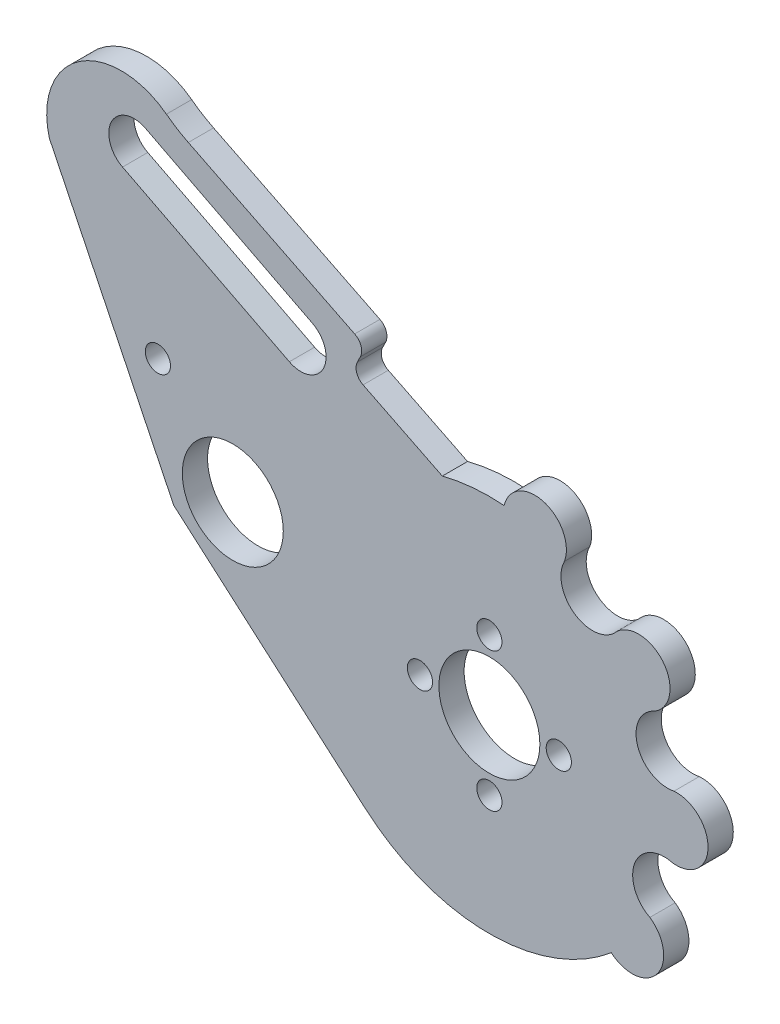
ISO-10303-21;
HEADER;
FILE_DESCRIPTION(('STEP AP214'),'2;1');
FILE_NAME('part.step','',(''),(''),'','','');
FILE_SCHEMA(('AUTOMOTIVE_DESIGN { 1 0 10303 214 1 1 1 1 }'));
ENDSEC;
DATA;
#1=APPLICATION_CONTEXT('core data for automotive mechanical design processes');
#2=APPLICATION_PROTOCOL_DEFINITION('international standard','automotive_design',2000,#1);
#3=PRODUCT_CONTEXT('',#1,'mechanical');
#4=PRODUCT('Part','Part','',(#3));
#5=PRODUCT_RELATED_PRODUCT_CATEGORY('part','',(#4));
#6=PRODUCT_DEFINITION_FORMATION('','',#4);
#7=PRODUCT_DEFINITION_CONTEXT('part definition',#1,'design');
#8=PRODUCT_DEFINITION('design','',#6,#7);
#9=PRODUCT_DEFINITION_SHAPE('','',#8);
#10=(LENGTH_UNIT() NAMED_UNIT(*) SI_UNIT(.MILLI.,.METRE.));
#11=(NAMED_UNIT(*) PLANE_ANGLE_UNIT() SI_UNIT($,.RADIAN.));
#12=(NAMED_UNIT(*) SI_UNIT($,.STERADIAN.) SOLID_ANGLE_UNIT());
#13=UNCERTAINTY_MEASURE_WITH_UNIT(LENGTH_MEASURE(1.E-05),#10,'distance_accuracy_value','');
#14=(GEOMETRIC_REPRESENTATION_CONTEXT(3) GLOBAL_UNCERTAINTY_ASSIGNED_CONTEXT((#13)) GLOBAL_UNIT_ASSIGNED_CONTEXT((#10,
#11,#12)) REPRESENTATION_CONTEXT('',''));
#15=CARTESIAN_POINT('',(0.,0.,0.));
#16=DIRECTION('',(0.,0.,1.));
#17=DIRECTION('',(1.,0.,0.));
#18=AXIS2_PLACEMENT_3D('',#15,#16,#17);
#19=CARTESIAN_POINT('',(-14.9359678839183,18.0926132591885,2.));
#20=DIRECTION('',(0.,0.,-1.));
#21=DIRECTION('',(-1.,0.,0.));
#22=AXIS2_PLACEMENT_3D('',#19,#20,#21);
#23=CYLINDRICAL_SURFACE('',#22,2.);
#24=CARTESIAN_POINT('',(-14.9359678839183,18.0926132591885,0.));
#25=DIRECTION('',(0.,0.,1.));
#26=DIRECTION('',(1.,0.,0.));
#27=AXIS2_PLACEMENT_3D('',#24,#25,#26);
#28=CIRCLE('',#27,2.);
#29=CARTESIAN_POINT('',(-15.846044198805,16.3116693799261,0.));
#30=VERTEX_POINT('',#29);
#31=CARTESIAN_POINT('',(-14.0258915690315,19.8735571384509,0.));
#32=VERTEX_POINT('',#31);
#33=EDGE_CURVE('E273',#30,#32,#28,.T.);
#34=ORIENTED_EDGE('',*,*,#33,.F.);
#35=DIRECTION('',(0.,0.,-1.));
#36=VECTOR('',#35,1.);
#37=CARTESIAN_POINT('',(-15.846044198805,16.3116693799261,2.));
#38=LINE('',#37,#36);
#39=CARTESIAN_POINT('',(-15.846044198805,16.3116693799261,2.));
#40=VERTEX_POINT('',#39);
#41=EDGE_CURVE('E224',#40,#30,#38,.T.);
#42=ORIENTED_EDGE('',*,*,#41,.F.);
#43=CARTESIAN_POINT('',(-14.9359678839183,18.0926132591885,2.));
#44=DIRECTION('',(0.,0.,1.));
#45=DIRECTION('',(1.,0.,0.));
#46=AXIS2_PLACEMENT_3D('',#43,#44,#45);
#47=CIRCLE('',#46,2.);
#48=CARTESIAN_POINT('',(-14.0258915690315,19.8735571384509,2.));
#49=VERTEX_POINT('',#48);
#50=EDGE_CURVE('E374',#40,#49,#47,.T.);
#51=ORIENTED_EDGE('',*,*,#50,.T.);
#52=DIRECTION('',(0.,0.,-1.));
#53=VECTOR('',#52,1.);
#54=CARTESIAN_POINT('',(-14.0258915690315,19.8735571384509,2.));
#55=LINE('',#54,#53);
#56=EDGE_CURVE('E213',#49,#32,#55,.T.);
#57=ORIENTED_EDGE('',*,*,#56,.T.);
#58=EDGE_LOOP('',(#34,#42,#51,#57));
#59=FACE_BOUND('',#58,.T.);
#60=ADVANCED_FACE('F35',(#59),#23,.F.);
#61=CARTESIAN_POINT('',(3.32838985168127,6.51338292974766,2.));
#62=DIRECTION('',(0.455038157443362,0.890471939631199,0.));
#63=DIRECTION('',(-0.890471939631199,0.455038157443362,0.));
#64=AXIS2_PLACEMENT_3D('',#61,#62,#63);
#65=PLANE('',#64);
#66=DIRECTION('',(0.890471939631199,-0.455038157443362,0.));
#67=VECTOR('',#66,1.);
#68=CARTESIAN_POINT('',(3.32838985168127,6.51338292974766,0.));
#69=LINE('',#68,#67);
#70=CARTESIAN_POINT('',(-29.0580755639299,23.0631212122661,0.));
#71=VERTEX_POINT('',#70);
#72=EDGE_CURVE('E276',#71,#30,#69,.T.);
#73=ORIENTED_EDGE('',*,*,#72,.F.);
#74=DIRECTION('',(0.,0.,-1.));
#75=VECTOR('',#74,1.);
#76=CARTESIAN_POINT('',(-29.0580755639299,23.0631212122661,2.));
#77=LINE('',#76,#75);
#78=CARTESIAN_POINT('',(-29.0580755639299,23.0631212122661,2.));
#79=VERTEX_POINT('',#78);
#80=EDGE_CURVE('E287',#79,#71,#77,.T.);
#81=ORIENTED_EDGE('',*,*,#80,.F.);
#82=DIRECTION('',(0.890471939631199,-0.455038157443362,0.));
#83=VECTOR('',#82,1.);
#84=CARTESIAN_POINT('',(3.32838985168127,6.51338292974766,2.));
#85=LINE('',#84,#83);
#86=EDGE_CURVE('E377',#79,#40,#85,.T.);
#87=ORIENTED_EDGE('',*,*,#86,.T.);
#88=ORIENTED_EDGE('',*,*,#41,.T.);
#89=EDGE_LOOP('',(#73,#81,#87,#88));
#90=FACE_BOUND('',#89,.T.);
#91=ADVANCED_FACE('F448',(#90),#65,.T.);
#92=CARTESIAN_POINT('',(-28.1479992490432,24.8440650915285,2.));
#93=DIRECTION('',(0.,0.,-1.));
#94=DIRECTION('',(-1.,0.,0.));
#95=AXIS2_PLACEMENT_3D('',#92,#93,#94);
#96=CYLINDRICAL_SURFACE('',#95,2.);
#97=CARTESIAN_POINT('',(-28.1479992490432,24.8440650915285,0.));
#98=DIRECTION('',(0.,0.,1.));
#99=DIRECTION('',(1.,0.,0.));
#100=AXIS2_PLACEMENT_3D('',#97,#98,#99);
#101=CIRCLE('',#100,2.);
#102=CARTESIAN_POINT('',(-27.2379229341565,26.6250089707909,0.));
#103=VERTEX_POINT('',#102);
#104=EDGE_CURVE('E279',#103,#71,#101,.T.);
#105=ORIENTED_EDGE('',*,*,#104,.F.);
#106=DIRECTION('',(0.,0.,-1.));
#107=VECTOR('',#106,1.);
#108=CARTESIAN_POINT('',(-27.2379229341565,26.6250089707909,2.));
#109=LINE('',#108,#107);
#110=CARTESIAN_POINT('',(-27.2379229341565,26.6250089707909,2.));
#111=VERTEX_POINT('',#110);
#112=EDGE_CURVE('E215',#111,#103,#109,.T.);
#113=ORIENTED_EDGE('',*,*,#112,.F.);
#114=CARTESIAN_POINT('',(-28.1479992490432,24.8440650915285,2.));
#115=DIRECTION('',(0.,0.,1.));
#116=DIRECTION('',(1.,0.,0.));
#117=AXIS2_PLACEMENT_3D('',#114,#115,#116);
#118=CIRCLE('',#117,2.);
#119=EDGE_CURVE('E380',#111,#79,#118,.T.);
#120=ORIENTED_EDGE('',*,*,#119,.T.);
#121=ORIENTED_EDGE('',*,*,#80,.T.);
#122=EDGE_LOOP('',(#105,#113,#120,#121));
#123=FACE_BOUND('',#122,.T.);
#124=ADVANCED_FACE('F454',(#123),#96,.F.);
#125=CARTESIAN_POINT('',(0.,0.,2.));
#126=DIRECTION('',(0.,0.,-1.));
#127=DIRECTION('',(-1.,0.,0.));
#128=AXIS2_PLACEMENT_3D('',#125,#126,#127);
#129=CYLINDRICAL_SURFACE('',#128,15.);
#130=CARTESIAN_POINT('',(0.,0.,0.));
#131=DIRECTION('',(0.,0.,1.));
#132=DIRECTION('',(1.,0.,0.));
#133=AXIS2_PLACEMENT_3D('',#130,#131,#132);
#134=CIRCLE('',#133,15.);
#135=CARTESIAN_POINT('',(-9.85060643306645,-11.3121860354588,0.));
#136=VERTEX_POINT('',#135);
#137=CARTESIAN_POINT('',(9.66110025477495,-11.4744560597524,0.));
#138=VERTEX_POINT('',#137);
#139=EDGE_CURVE('E212',#136,#138,#134,.T.);
#140=ORIENTED_EDGE('',*,*,#139,.T.);
#141=DIRECTION('',(0.,0.,-1.));
#142=VECTOR('',#141,1.);
#143=CARTESIAN_POINT('',(9.66110025477495,-11.4744560597524,2.));
#144=LINE('',#143,#142);
#145=CARTESIAN_POINT('',(9.66110025477495,-11.4744560597524,2.));
#146=VERTEX_POINT('',#145);
#147=EDGE_CURVE('E189',#146,#138,#144,.T.);
#148=ORIENTED_EDGE('',*,*,#147,.F.);
#149=CARTESIAN_POINT('',(0.,0.,2.));
#150=DIRECTION('',(0.,0.,1.));
#151=DIRECTION('',(1.,0.,0.));
#152=AXIS2_PLACEMENT_3D('',#149,#150,#151);
#153=CIRCLE('',#152,15.);
#154=CARTESIAN_POINT('',(-9.85060643306645,-11.3121860354588,2.));
#155=VERTEX_POINT('',#154);
#156=EDGE_CURVE('E196',#155,#146,#153,.T.);
#157=ORIENTED_EDGE('',*,*,#156,.F.);
#158=DIRECTION('',(0.,0.,-1.));
#159=VECTOR('',#158,1.);
#160=CARTESIAN_POINT('',(-9.85060643306645,-11.3121860354588,2.));
#161=LINE('',#160,#159);
#162=EDGE_CURVE('E290',#155,#136,#161,.T.);
#163=ORIENTED_EDGE('',*,*,#162,.T.);
#164=EDGE_LOOP('',(#140,#148,#157,#163));
#165=FACE_BOUND('',#164,.T.);
#166=ADVANCED_FACE('F210',(#165),#129,.T.);
#167=CARTESIAN_POINT('',(11.3067980667604,-9.59252122782368,2.));
#168=DIRECTION('',(0.,0.,-1.));
#169=DIRECTION('',(-1.,0.,0.));
#170=AXIS2_PLACEMENT_3D('',#167,#168,#169);
#171=CYLINDRICAL_SURFACE('',#170,2.5);
#172=CARTESIAN_POINT('',(11.3067980667604,-9.59252122782368,0.));
#173=DIRECTION('',(0.,0.,1.));
#174=DIRECTION('',(1.,0.,0.));
#175=AXIS2_PLACEMENT_3D('',#172,#173,#174);
#176=CIRCLE('',#175,2.5);
#177=CARTESIAN_POINT('',(12.711512496022,-7.52448414589692,0.));
#178=VERTEX_POINT('',#177);
#179=EDGE_CURVE('E329',#138,#178,#176,.T.);
#180=ORIENTED_EDGE('',*,*,#179,.T.);
#181=DIRECTION('',(0.,0.,-1.));
#182=VECTOR('',#181,1.);
#183=CARTESIAN_POINT('',(12.711512496022,-7.52448414589692,2.));
#184=LINE('',#183,#182);
#185=CARTESIAN_POINT('',(12.711512496022,-7.52448414589692,2.));
#186=VERTEX_POINT('',#185);
#187=EDGE_CURVE('E191',#186,#178,#184,.T.);
#188=ORIENTED_EDGE('',*,*,#187,.F.);
#189=CARTESIAN_POINT('',(11.3067980667604,-9.59252122782368,2.));
#190=DIRECTION('',(0.,0.,1.));
#191=DIRECTION('',(1.,0.,0.));
#192=AXIS2_PLACEMENT_3D('',#189,#190,#191);
#193=CIRCLE('',#192,2.5);
#194=EDGE_CURVE('E184',#146,#186,#193,.T.);
#195=ORIENTED_EDGE('',*,*,#194,.F.);
#196=ORIENTED_EDGE('',*,*,#147,.T.);
#197=EDGE_LOOP('',(#180,#188,#195,#196));
#198=FACE_BOUND('',#197,.T.);
#199=ADVANCED_FACE('F187',(#198),#171,.T.);
#200=CARTESIAN_POINT('',(13.8488157974996,-5.29815505960978,2.));
#201=DIRECTION('',(0.,0.,-1.));
#202=DIRECTION('',(-1.,0.,0.));
#203=AXIS2_PLACEMENT_3D('',#200,#201,#202);
#204=CYLINDRICAL_SURFACE('',#203,2.5);
#205=CARTESIAN_POINT('',(13.8488157974996,-5.29815505960978,0.));
#206=DIRECTION('',(0.,0.,1.));
#207=DIRECTION('',(1.,0.,0.));
#208=AXIS2_PLACEMENT_3D('',#205,#206,#207);
#209=CIRCLE('',#208,2.5);
#210=CARTESIAN_POINT('',(14.4878912158803,-2.88121844281123,0.));
#211=VERTEX_POINT('',#210);
#212=EDGE_CURVE('E323',#211,#178,#209,.T.);
#213=ORIENTED_EDGE('',*,*,#212,.F.);
#214=DIRECTION('',(0.,0.,-1.));
#215=VECTOR('',#214,1.);
#216=CARTESIAN_POINT('',(14.4878912158803,-2.88121844281123,2.));
#217=LINE('',#216,#215);
#218=CARTESIAN_POINT('',(14.4878912158803,-2.88121844281123,2.));
#219=VERTEX_POINT('',#218);
#220=EDGE_CURVE('E217',#219,#211,#217,.T.);
#221=ORIENTED_EDGE('',*,*,#220,.F.);
#222=CARTESIAN_POINT('',(13.8488157974996,-5.29815505960978,2.));
#223=DIRECTION('',(0.,0.,1.));
#224=DIRECTION('',(1.,0.,0.));
#225=AXIS2_PLACEMENT_3D('',#222,#223,#224);
#226=CIRCLE('',#225,2.5);
#227=EDGE_CURVE('E195',#219,#186,#226,.T.);
#228=ORIENTED_EDGE('',*,*,#227,.T.);
#229=ORIENTED_EDGE('',*,*,#187,.T.);
#230=EDGE_LOOP('',(#213,#221,#228,#229));
#231=FACE_BOUND('',#230,.T.);
#232=ADVANCED_FACE('F328',(#231),#204,.F.);
#233=CARTESIAN_POINT('',(14.8221859615863,-0.403669851361737,2.));
#234=DIRECTION('',(0.,0.,-1.));
#235=DIRECTION('',(-1.,0.,0.));
#236=AXIS2_PLACEMENT_3D('',#233,#234,#235);
#237=CYLINDRICAL_SURFACE('',#236,2.5);
#238=CARTESIAN_POINT('',(14.8221859615863,-0.403669851361737,0.));
#239=DIRECTION('',(0.,0.,1.));
#240=DIRECTION('',(1.,0.,0.));
#241=AXIS2_PLACEMENT_3D('',#238,#239,#240);
#242=CIRCLE('',#241,2.5);
#243=CARTESIAN_POINT('',(14.6232346563307,2.08840125078144,0.));
#244=VERTEX_POINT('',#243);
#245=EDGE_CURVE('E317',#211,#244,#242,.T.);
#246=ORIENTED_EDGE('',*,*,#245,.T.);
#247=DIRECTION('',(0.,0.,-1.));
#248=VECTOR('',#247,1.);
#249=CARTESIAN_POINT('',(14.6232346563307,2.08840125078144,2.));
#250=LINE('',#249,#248);
#251=CARTESIAN_POINT('',(14.6232346563307,2.08840125078144,2.));
#252=VERTEX_POINT('',#251);
#253=EDGE_CURVE('E310',#252,#244,#250,.T.);
#254=ORIENTED_EDGE('',*,*,#253,.F.);
#255=CARTESIAN_POINT('',(14.8221859615863,-0.403669851361737,2.));
#256=DIRECTION('',(0.,0.,1.));
#257=DIRECTION('',(1.,0.,0.));
#258=AXIS2_PLACEMENT_3D('',#255,#256,#257);
#259=CIRCLE('',#258,2.5);
#260=EDGE_CURVE('E319',#219,#252,#259,.T.);
#261=ORIENTED_EDGE('',*,*,#260,.F.);
#262=ORIENTED_EDGE('',*,*,#220,.T.);
#263=EDGE_LOOP('',(#246,#254,#261,#262));
#264=FACE_BOUND('',#263,.T.);
#265=ADVANCED_FACE('F315',(#264),#237,.T.);
#266=CARTESIAN_POINT('',(14.1166554686715,4.53653881363009,2.));
#267=DIRECTION('',(0.,0.,-1.));
#268=DIRECTION('',(-1.,0.,0.));
#269=AXIS2_PLACEMENT_3D('',#266,#267,#268);
#270=CYLINDRICAL_SURFACE('',#269,2.50000000000001);
#271=CARTESIAN_POINT('',(14.1166554686715,4.53653881363009,0.));
#272=DIRECTION('',(0.,0.,1.));
#273=DIRECTION('',(1.,0.,0.));
#274=AXIS2_PLACEMENT_3D('',#271,#272,#273);
#275=CIRCLE('',#274,2.50000000000001);
#276=CARTESIAN_POINT('',(13.1022125420899,6.82146891074653,0.));
#277=VERTEX_POINT('',#276);
#278=EDGE_CURVE('E326',#277,#244,#275,.T.);
#279=ORIENTED_EDGE('',*,*,#278,.F.);
#280=DIRECTION('',(0.,0.,-1.));
#281=VECTOR('',#280,1.);
#282=CARTESIAN_POINT('',(13.1022125420899,6.82146891074653,2.));
#283=LINE('',#282,#281);
#284=CARTESIAN_POINT('',(13.1022125420899,6.82146891074653,2.));
#285=VERTEX_POINT('',#284);
#286=EDGE_CURVE('E308',#285,#277,#283,.T.);
#287=ORIENTED_EDGE('',*,*,#286,.F.);
#288=CARTESIAN_POINT('',(14.1166554686715,4.53653881363009,2.));
#289=DIRECTION('',(0.,0.,1.));
#290=DIRECTION('',(1.,0.,0.));
#291=AXIS2_PLACEMENT_3D('',#288,#289,#290);
#292=CIRCLE('',#291,2.50000000000001);
#293=EDGE_CURVE('E424',#285,#252,#292,.T.);
#294=ORIENTED_EDGE('',*,*,#293,.T.);
#295=ORIENTED_EDGE('',*,*,#253,.T.);
#296=EDGE_LOOP('',(#279,#287,#294,#295));
#297=FACE_BOUND('',#296,.T.);
#298=ADVANCED_FACE('F438',(#297),#270,.F.);
#299=CARTESIAN_POINT('',(11.8121393603798,8.96289628187838,2.));
#300=DIRECTION('',(0.,0.,-1.));
#301=DIRECTION('',(-1.,0.,0.));
#302=AXIS2_PLACEMENT_3D('',#299,#300,#301);
#303=CYLINDRICAL_SURFACE('',#302,2.5);
#304=CARTESIAN_POINT('',(11.8121393603798,8.96289628187838,0.));
#305=DIRECTION('',(0.,0.,1.));
#306=DIRECTION('',(1.,0.,0.));
#307=AXIS2_PLACEMENT_3D('',#304,#305,#306);
#308=CIRCLE('',#307,2.5);
#309=CARTESIAN_POINT('',(10.0971101914994,10.7818726285881,0.));
#310=VERTEX_POINT('',#309);
#311=EDGE_CURVE('E335',#277,#310,#308,.T.);
#312=ORIENTED_EDGE('',*,*,#311,.T.);
#313=DIRECTION('',(0.,0.,-1.));
#314=VECTOR('',#313,1.);
#315=CARTESIAN_POINT('',(10.0971101914994,10.7818726285881,2.));
#316=LINE('',#315,#314);
#317=CARTESIAN_POINT('',(10.0971101914994,10.7818726285881,2.));
#318=VERTEX_POINT('',#317);
#319=EDGE_CURVE('E306',#318,#310,#316,.T.);
#320=ORIENTED_EDGE('',*,*,#319,.F.);
#321=CARTESIAN_POINT('',(11.8121393603798,8.96289628187838,2.));
#322=DIRECTION('',(0.,0.,1.));
#323=DIRECTION('',(1.,0.,0.));
#324=AXIS2_PLACEMENT_3D('',#321,#322,#323);
#325=CIRCLE('',#324,2.5);
#326=EDGE_CURVE('E427',#285,#318,#325,.T.);
#327=ORIENTED_EDGE('',*,*,#326,.F.);
#328=ORIENTED_EDGE('',*,*,#286,.T.);
#329=EDGE_LOOP('',(#312,#320,#327,#328));
#330=FACE_BOUND('',#329,.T.);
#331=ADVANCED_FACE('F436',(#330),#303,.T.);
#332=CARTESIAN_POINT('',(8.16966887854774,12.3740315355842,2.));
#333=DIRECTION('',(0.,0.,-1.));
#334=DIRECTION('',(-1.,0.,0.));
#335=AXIS2_PLACEMENT_3D('',#332,#333,#334);
#336=CYLINDRICAL_SURFACE('',#335,2.5);
#337=CARTESIAN_POINT('',(8.16966887854774,12.3740315355842,0.));
#338=DIRECTION('',(0.,0.,1.));
#339=DIRECTION('',(1.,0.,0.));
#340=AXIS2_PLACEMENT_3D('',#337,#338,#339);
#341=CIRCLE('',#340,2.5);
#342=CARTESIAN_POINT('',(5.94831385553742,13.5210197054215,0.));
#343=VERTEX_POINT('',#342);
#344=EDGE_CURVE('E338',#343,#310,#341,.T.);
#345=ORIENTED_EDGE('',*,*,#344,.F.);
#346=DIRECTION('',(0.,0.,-1.));
#347=VECTOR('',#346,1.);
#348=CARTESIAN_POINT('',(5.94831385553742,13.5210197054215,2.));
#349=LINE('',#348,#347);
#350=CARTESIAN_POINT('',(5.94831385553742,13.5210197054215,2.));
#351=VERTEX_POINT('',#350);
#352=EDGE_CURVE('E304',#351,#343,#349,.T.);
#353=ORIENTED_EDGE('',*,*,#352,.F.);
#354=CARTESIAN_POINT('',(8.16966887854774,12.3740315355842,2.));
#355=DIRECTION('',(0.,0.,1.));
#356=DIRECTION('',(1.,0.,0.));
#357=AXIS2_PLACEMENT_3D('',#354,#355,#356);
#358=CIRCLE('',#357,2.5);
#359=EDGE_CURVE('E417',#351,#318,#358,.T.);
#360=ORIENTED_EDGE('',*,*,#359,.T.);
#361=ORIENTED_EDGE('',*,*,#319,.T.);
#362=EDGE_LOOP('',(#345,#353,#360,#361));
#363=FACE_BOUND('',#362,.T.);
#364=ADVANCED_FACE('F431',(#363),#336,.F.);
#365=CARTESIAN_POINT('',(3.60182460345563,14.3835672054844,2.));
#366=DIRECTION('',(0.,0.,-1.));
#367=DIRECTION('',(-1.,0.,0.));
#368=AXIS2_PLACEMENT_3D('',#365,#366,#367);
#369=CYLINDRICAL_SURFACE('',#368,2.5);
#370=CARTESIAN_POINT('',(3.60182460345563,14.3835672054844,0.));
#371=DIRECTION('',(0.,0.,1.));
#372=DIRECTION('',(1.,0.,0.));
#373=AXIS2_PLACEMENT_3D('',#370,#371,#372);
#374=CIRCLE('',#373,2.5);
#375=CARTESIAN_POINT('',(1.16788239643984,14.95446591183,0.));
#376=VERTEX_POINT('',#375);
#377=EDGE_CURVE('E341',#343,#376,#374,.T.);
#378=ORIENTED_EDGE('',*,*,#377,.T.);
#379=DIRECTION('',(0.,0.,-1.));
#380=VECTOR('',#379,1.);
#381=CARTESIAN_POINT('',(1.16788239643984,14.95446591183,2.));
#382=LINE('',#381,#380);
#383=CARTESIAN_POINT('',(1.16788239643984,14.95446591183,2.));
#384=VERTEX_POINT('',#383);
#385=EDGE_CURVE('E301',#384,#376,#382,.T.);
#386=ORIENTED_EDGE('',*,*,#385,.F.);
#387=CARTESIAN_POINT('',(3.60182460345563,14.3835672054844,2.));
#388=DIRECTION('',(0.,0.,1.));
#389=DIRECTION('',(1.,0.,0.));
#390=AXIS2_PLACEMENT_3D('',#387,#388,#389);
#391=CIRCLE('',#390,2.5);
#392=EDGE_CURVE('E416',#351,#384,#391,.T.);
#393=ORIENTED_EDGE('',*,*,#392,.F.);
#394=ORIENTED_EDGE('',*,*,#352,.T.);
#395=EDGE_LOOP('',(#378,#386,#393,#394));
#396=FACE_BOUND('',#395,.T.);
#397=ADVANCED_FACE('F487',(#396),#369,.T.);
#398=CARTESIAN_POINT('',(-3.72843212824844,14.529239273446,0.));
#399=VERTEX_POINT('',#398);
#400=EDGE_CURVE('E343',#376,#399,#134,.T.);
#401=ORIENTED_EDGE('',*,*,#400,.T.);
#402=DIRECTION('',(0.,0.,-1.));
#403=VECTOR('',#402,1.);
#404=CARTESIAN_POINT('',(-3.72843212824844,14.529239273446,2.));
#405=LINE('',#404,#403);
#406=CARTESIAN_POINT('',(-3.72843212824844,14.529239273446,2.));
#407=VERTEX_POINT('',#406);
#408=EDGE_CURVE('E298',#407,#399,#405,.T.);
#409=ORIENTED_EDGE('',*,*,#408,.F.);
#410=EDGE_CURVE('E209',#384,#407,#153,.T.);
#411=ORIENTED_EDGE('',*,*,#410,.F.);
#412=ORIENTED_EDGE('',*,*,#385,.T.);
#413=EDGE_LOOP('',(#401,#409,#411,#412));
#414=FACE_BOUND('',#413,.T.);
#415=ADVANCED_FACE('F402',(#414),#129,.T.);
#416=CARTESIAN_POINT('',(5.0508803223758,10.1683141739315,2.));
#417=DIRECTION('',(0.444867319818385,0.895596487128889,0.));
#418=DIRECTION('',(-0.895596487128889,0.444867319818385,0.));
#419=AXIS2_PLACEMENT_3D('',#416,#417,#418);
#420=PLANE('',#419);
#421=DIRECTION('',(0.895596487128889,-0.444867319818385,0.));
#422=VECTOR('',#421,1.);
#423=CARTESIAN_POINT('',(5.0508803223758,10.1683141739315,0.));
#424=LINE('',#423,#422);
#425=CARTESIAN_POINT('',(-10.006536836479,17.6477459393702,0.));
#426=VERTEX_POINT('',#425);
#427=EDGE_CURVE('E344',#426,#399,#424,.T.);
#428=ORIENTED_EDGE('',*,*,#427,.F.);
#429=DIRECTION('',(0.,0.,-1.));
#430=VECTOR('',#429,1.);
#431=CARTESIAN_POINT('',(-10.006536836479,17.6477459393702,2.));
#432=LINE('',#431,#430);
#433=CARTESIAN_POINT('',(-10.006536836479,17.6477459393702,2.));
#434=VERTEX_POINT('',#433);
#435=EDGE_CURVE('E227',#426,#434,#432,.F.);
#436=ORIENTED_EDGE('',*,*,#435,.T.);
#437=DIRECTION('',(0.895596487128889,-0.444867319818385,0.));
#438=VECTOR('',#437,1.);
#439=CARTESIAN_POINT('',(5.0508803223758,10.1683141739315,2.));
#440=LINE('',#439,#438);
#441=EDGE_CURVE('E362',#434,#407,#440,.T.);
#442=ORIENTED_EDGE('',*,*,#441,.T.);
#443=ORIENTED_EDGE('',*,*,#408,.T.);
#444=EDGE_LOOP('',(#428,#436,#442,#443));
#445=FACE_BOUND('',#444,.T.);
#446=ADVANCED_FACE('F410',(#445),#420,.T.);
#447=CARTESIAN_POINT('',(-15.9530136459837,7.92429908525706,2.));
#448=DIRECTION('',(-0.895596487128889,0.444867319818385,0.));
#449=DIRECTION('',(-0.444867319818385,-0.895596487128889,0.));
#450=AXIS2_PLACEMENT_3D('',#447,#448,#449);
#451=PLANE('',#450);
#452=DIRECTION('',(0.444867319818385,0.895596487128889,0.));
#453=VECTOR('',#452,1.);
#454=CARTESIAN_POINT('',(-15.9530136459837,7.92429908525706,2.));
#455=LINE('',#454,#453);
#456=CARTESIAN_POINT('',(-10.4572660037895,18.9882097463174,2.));
#457=VERTEX_POINT('',#456);
#458=CARTESIAN_POINT('',(-10.2190110297542,19.4678590895735,2.));
#459=VERTEX_POINT('',#458);
#460=EDGE_CURVE('E357',#457,#459,#455,.T.);
#461=ORIENTED_EDGE('',*,*,#460,.F.);
#462=DIRECTION('',(0.,0.,-1.));
#463=VECTOR('',#462,1.);
#464=CARTESIAN_POINT('',(-10.4572660037895,18.9882097463174,2.));
#465=LINE('',#464,#463);
#466=CARTESIAN_POINT('',(-10.4572660037895,18.9882097463174,0.));
#467=VERTEX_POINT('',#466);
#468=EDGE_CURVE('E223',#457,#467,#465,.T.);
#469=ORIENTED_EDGE('',*,*,#468,.T.);
#470=DIRECTION('',(0.444867319818385,0.895596487128889,0.));
#471=VECTOR('',#470,1.);
#472=CARTESIAN_POINT('',(-15.9530136459837,7.92429908525706,0.));
#473=LINE('',#472,#471);
#474=CARTESIAN_POINT('',(-10.2190110297542,19.4678590895735,0.));
#475=VERTEX_POINT('',#474);
#476=EDGE_CURVE('E262',#467,#475,#473,.T.);
#477=ORIENTED_EDGE('',*,*,#476,.T.);
#478=DIRECTION('',(0.,0.,-1.));
#479=VECTOR('',#478,1.);
#480=CARTESIAN_POINT('',(-10.2190110297543,19.4678590895735,2.));
#481=LINE('',#480,#479);
#482=EDGE_CURVE('E221',#475,#459,#481,.F.);
#483=ORIENTED_EDGE('',*,*,#482,.T.);
#484=EDGE_LOOP('',(#461,#469,#477,#483));
#485=FACE_BOUND('',#484,.T.);
#486=ADVANCED_FACE('F350',(#485),#451,.F.);
#487=CARTESIAN_POINT('',(6.17886993604783,12.4391564914453,2.));
#488=DIRECTION('',(-0.444867319818385,-0.895596487128889,0.));
#489=DIRECTION('',(0.895596487128889,-0.444867319818385,0.));
#490=AXIS2_PLACEMENT_3D('',#487,#488,#489);
#491=PLANE('',#490);
#492=DIRECTION('',(-0.895596487128889,0.444867319818385,0.));
#493=VECTOR('',#492,1.);
#494=CARTESIAN_POINT('',(6.17886993604783,12.4391564914453,0.));
#495=LINE('',#494,#493);
#496=CARTESIAN_POINT('',(-10.6697401970648,20.8083228965207,0.));
#497=VERTEX_POINT('',#496);
#498=CARTESIAN_POINT('',(-23.8481710126918,27.3544106498957,0.));
#499=VERTEX_POINT('',#498);
#500=EDGE_CURVE('E258',#497,#499,#495,.T.);
#501=ORIENTED_EDGE('',*,*,#500,.T.);
#502=DIRECTION('',(0.,0.,1.));
#503=VECTOR('',#502,1.);
#504=CARTESIAN_POINT('',(-23.8481710126918,27.3544106498957,2.));
#505=LINE('',#504,#503);
#506=CARTESIAN_POINT('',(-23.8481710126918,27.3544106498957,2.));
#507=VERTEX_POINT('',#506);
#508=EDGE_CURVE('E56',#499,#507,#505,.T.);
#509=ORIENTED_EDGE('',*,*,#508,.T.);
#510=DIRECTION('',(-0.895596487128889,0.444867319818385,0.));
#511=VECTOR('',#510,1.);
#512=CARTESIAN_POINT('',(6.17886993604783,12.4391564914453,2.));
#513=LINE('',#512,#511);
#514=CARTESIAN_POINT('',(-10.6697401970648,20.8083228965207,2.));
#515=VERTEX_POINT('',#514);
#516=EDGE_CURVE('E356',#515,#507,#513,.T.);
#517=ORIENTED_EDGE('',*,*,#516,.F.);
#518=DIRECTION('',(0.,0.,-1.));
#519=VECTOR('',#518,1.);
#520=CARTESIAN_POINT('',(-10.6697401970648,20.8083228965207,2.));
#521=LINE('',#520,#519);
#522=EDGE_CURVE('E229',#515,#497,#521,.T.);
#523=ORIENTED_EDGE('',*,*,#522,.T.);
#524=EDGE_LOOP('',(#501,#509,#517,#523));
#525=FACE_BOUND('',#524,.T.);
#526=ADVANCED_FACE('F358',(#525),#491,.F.);
#527=CARTESIAN_POINT('',(-29.1494212263783,23.7070956599862,2.));
#528=DIRECTION('',(0.,0.,-1.));
#529=DIRECTION('',(-1.,0.,0.));
#530=AXIS2_PLACEMENT_3D('',#527,#528,#529);
#531=CYLINDRICAL_SURFACE('',#530,5.91606989611819);
#532=CARTESIAN_POINT('',(-29.1494212263783,23.7070956599862,2.));
#533=DIRECTION('',(0.,0.,1.));
#534=DIRECTION('',(1.,0.,0.));
#535=AXIS2_PLACEMENT_3D('',#532,#533,#534);
#536=CIRCLE('',#535,5.91606989611819);
#537=CARTESIAN_POINT('',(-25.583989366889,28.4280678767117,2.));
#538=VERTEX_POINT('',#537);
#539=CARTESIAN_POINT('',(-34.8560748827532,22.1469716066049,2.));
#540=VERTEX_POINT('',#539);
#541=EDGE_CURVE('E250',#538,#540,#536,.T.);
#542=ORIENTED_EDGE('',*,*,#541,.F.);
#543=DIRECTION('',(0.,0.,-1.));
#544=VECTOR('',#543,1.);
#545=CARTESIAN_POINT('',(-25.583989366889,28.4280678767117,2.));
#546=LINE('',#545,#544);
#547=CARTESIAN_POINT('',(-25.583989366889,28.4280678767117,0.));
#548=VERTEX_POINT('',#547);
#549=EDGE_CURVE('E240',#538,#548,#546,.T.);
#550=ORIENTED_EDGE('',*,*,#549,.T.);
#551=CARTESIAN_POINT('',(-29.1494212263783,23.7070956599862,0.));
#552=DIRECTION('',(0.,0.,1.));
#553=DIRECTION('',(1.,0.,0.));
#554=AXIS2_PLACEMENT_3D('',#551,#552,#553);
#555=CIRCLE('',#554,5.91606989611819);
#556=CARTESIAN_POINT('',(-34.8560748827532,22.1469716066049,0.));
#557=VERTEX_POINT('',#556);
#558=EDGE_CURVE('E248',#548,#557,#555,.T.);
#559=ORIENTED_EDGE('',*,*,#558,.T.);
#560=DIRECTION('',(0.,0.,-1.));
#561=VECTOR('',#560,1.);
#562=CARTESIAN_POINT('',(-34.8560748827532,22.1469716066049,2.));
#563=LINE('',#562,#561);
#564=EDGE_CURVE('E296',#540,#557,#563,.T.);
#565=ORIENTED_EDGE('',*,*,#564,.F.);
#566=EDGE_LOOP('',(#542,#550,#559,#565));
#567=FACE_BOUND('',#566,.T.);
#568=ADVANCED_FACE('F246',(#567),#531,.T.);
#569=CARTESIAN_POINT('',(-19.4840843288905,-9.47234706105984,2.));
#570=DIRECTION('',(0.899351207341315,0.437226950054224,0.));
#571=DIRECTION('',(-0.437226950054224,0.899351207341315,0.));
#572=AXIS2_PLACEMENT_3D('',#569,#570,#571);
#573=PLANE('',#572);
#574=DIRECTION('',(0.437226950054225,-0.899351207341315,0.));
#575=VECTOR('',#574,1.);
#576=CARTESIAN_POINT('',(-19.4840843288905,-9.47234706105984,0.));
#577=LINE('',#576,#575);
#578=CARTESIAN_POINT('',(-25.0052814935504,1.88444449854211,0.));
#579=VERTEX_POINT('',#578);
#580=EDGE_CURVE('E257',#557,#579,#577,.T.);
#581=ORIENTED_EDGE('',*,*,#580,.T.);
#582=DIRECTION('',(0.,0.,-1.));
#583=VECTOR('',#582,1.);
#584=CARTESIAN_POINT('',(-25.0052814935504,1.88444449854211,2.));
#585=LINE('',#584,#583);
#586=CARTESIAN_POINT('',(-25.0052814935504,1.88444449854211,2.));
#587=VERTEX_POINT('',#586);
#588=EDGE_CURVE('E292',#587,#579,#585,.T.);
#589=ORIENTED_EDGE('',*,*,#588,.F.);
#590=DIRECTION('',(0.437226950054225,-0.899351207341315,0.));
#591=VECTOR('',#590,1.);
#592=CARTESIAN_POINT('',(-19.4840843288905,-9.47234706105984,2.));
#593=LINE('',#592,#591);
#594=EDGE_CURVE('E360',#540,#587,#593,.T.);
#595=ORIENTED_EDGE('',*,*,#594,.F.);
#596=ORIENTED_EDGE('',*,*,#564,.T.);
#597=EDGE_LOOP('',(#581,#589,#595,#596));
#598=FACE_BOUND('',#597,.T.);
#599=ADVANCED_FACE('F464',(#598),#573,.F.);
#600=CARTESIAN_POINT('',(-20.325227828694,4.43909071557608,2.));
#601=DIRECTION('',(0.,0.,-1.));
#602=DIRECTION('',(-1.,0.,0.));
#603=AXIS2_PLACEMENT_3D('',#600,#601,#602);
#604=CYLINDRICAL_SURFACE('',#603,4.);
#605=CARTESIAN_POINT('',(-20.325227828694,4.43909071557608,2.));
#606=DIRECTION('',(0.,0.,1.));
#607=DIRECTION('',(1.,0.,0.));
#608=AXIS2_PLACEMENT_3D('',#605,#606,#607);
#609=CIRCLE('',#608,4.);
#610=CARTESIAN_POINT('',(-16.325227828694,4.43909071557608,2.));
#611=VERTEX_POINT('',#610);
#612=EDGE_CURVE('E371',#611,#611,#609,.T.);
#613=ORIENTED_EDGE('',*,*,#612,.T.);
#614=EDGE_LOOP('',(#613));
#615=FACE_BOUND('',#614,.T.);
#616=CARTESIAN_POINT('',(-20.325227828694,4.43909071557608,0.));
#617=DIRECTION('',(0.,0.,1.));
#618=DIRECTION('',(1.,0.,0.));
#619=AXIS2_PLACEMENT_3D('',#616,#617,#618);
#620=CIRCLE('',#619,4.);
#621=CARTESIAN_POINT('',(-16.325227828694,4.43909071557608,0.));
#622=VERTEX_POINT('',#621);
#623=EDGE_CURVE('E270',#622,#622,#620,.T.);
#624=ORIENTED_EDGE('',*,*,#623,.F.);
#625=EDGE_LOOP('',(#624));
#626=FACE_BOUND('',#625,.T.);
#627=ADVANCED_FACE('F460',(#615,#626),#604,.F.);
#628=CARTESIAN_POINT('',(-26.2563871432768,11.3193235152207,2.));
#629=DIRECTION('',(0.,0.,-1.));
#630=DIRECTION('',(-1.,0.,0.));
#631=AXIS2_PLACEMENT_3D('',#628,#629,#630);
#632=CYLINDRICAL_SURFACE('',#631,1.);
#633=CARTESIAN_POINT('',(-26.2563871432768,11.3193235152207,2.));
#634=DIRECTION('',(0.,0.,1.));
#635=DIRECTION('',(1.,0.,0.));
#636=AXIS2_PLACEMENT_3D('',#633,#634,#635);
#637=CIRCLE('',#636,1.);
#638=CARTESIAN_POINT('',(-25.2563871432768,11.3193235152207,2.));
#639=VERTEX_POINT('',#638);
#640=EDGE_CURVE('E368',#639,#639,#637,.T.);
#641=ORIENTED_EDGE('',*,*,#640,.T.);
#642=EDGE_LOOP('',(#641));
#643=FACE_BOUND('',#642,.T.);
#644=CARTESIAN_POINT('',(-26.2563871432768,11.3193235152207,0.));
#645=DIRECTION('',(0.,0.,1.));
#646=DIRECTION('',(1.,0.,0.));
#647=AXIS2_PLACEMENT_3D('',#644,#645,#646);
#648=CIRCLE('',#647,1.);
#649=CARTESIAN_POINT('',(-25.2563871432768,11.3193235152207,0.));
#650=VERTEX_POINT('',#649);
#651=EDGE_CURVE('E267',#650,#650,#648,.T.);
#652=ORIENTED_EDGE('',*,*,#651,.F.);
#653=EDGE_LOOP('',(#652));
#654=FACE_BOUND('',#653,.T.);
#655=ADVANCED_FACE('F463',(#643,#654),#632,.F.);
#656=CARTESIAN_POINT('',(-9.85060643306644,-11.3121860354588,2.));
#657=DIRECTION('',(0.656707095537763,0.754145735697256,0.));
#658=DIRECTION('',(-0.754145735697256,0.656707095537763,0.));
#659=AXIS2_PLACEMENT_3D('',#656,#657,#658);
#660=PLANE('',#659);
#661=DIRECTION('',(0.754145735697256,-0.656707095537763,0.));
#662=VECTOR('',#661,1.);
#663=CARTESIAN_POINT('',(-9.85060643306644,-11.3121860354588,0.));
#664=LINE('',#663,#662);
#665=EDGE_CURVE('E260',#579,#136,#664,.T.);
#666=ORIENTED_EDGE('',*,*,#665,.T.);
#667=ORIENTED_EDGE('',*,*,#162,.F.);
#668=DIRECTION('',(0.754145735697256,-0.656707095537763,0.));
#669=VECTOR('',#668,1.);
#670=CARTESIAN_POINT('',(-9.85060643306644,-11.3121860354588,2.));
#671=LINE('',#670,#669);
#672=EDGE_CURVE('E203',#587,#155,#671,.T.);
#673=ORIENTED_EDGE('',*,*,#672,.F.);
#674=ORIENTED_EDGE('',*,*,#588,.T.);
#675=EDGE_LOOP('',(#666,#667,#673,#674));
#676=FACE_BOUND('',#675,.T.);
#677=ADVANCED_FACE('F468',(#676),#660,.F.);
#678=CARTESIAN_POINT('',(0.,0.,2.));
#679=DIRECTION('',(0.,0.,-1.));
#680=DIRECTION('',(-1.,0.,0.));
#681=AXIS2_PLACEMENT_3D('',#678,#679,#680);
#682=CYLINDRICAL_SURFACE('',#681,4.);
#683=CARTESIAN_POINT('',(0.,0.,2.));
#684=DIRECTION('',(0.,0.,1.));
#685=DIRECTION('',(1.,0.,0.));
#686=AXIS2_PLACEMENT_3D('',#683,#684,#685);
#687=CIRCLE('',#686,4.);
#688=CARTESIAN_POINT('',(4.,0.,2.));
#689=VERTEX_POINT('',#688);
#690=EDGE_CURVE('E207',#689,#689,#687,.T.);
#691=ORIENTED_EDGE('',*,*,#690,.T.);
#692=EDGE_LOOP('',(#691));
#693=FACE_BOUND('',#692,.T.);
#694=CARTESIAN_POINT('',(0.,0.,0.));
#695=DIRECTION('',(0.,0.,1.));
#696=DIRECTION('',(1.,0.,0.));
#697=AXIS2_PLACEMENT_3D('',#694,#695,#696);
#698=CIRCLE('',#697,4.);
#699=CARTESIAN_POINT('',(4.,0.,0.));
#700=VERTEX_POINT('',#699);
#701=EDGE_CURVE('E396',#700,#700,#698,.T.);
#702=ORIENTED_EDGE('',*,*,#701,.F.);
#703=EDGE_LOOP('',(#702));
#704=FACE_BOUND('',#703,.T.);
#705=ADVANCED_FACE('F472',(#693,#704),#682,.F.);
#706=CARTESIAN_POINT('',(0.,5.5,2.));
#707=DIRECTION('',(0.,0.,-1.));
#708=DIRECTION('',(-1.,0.,0.));
#709=AXIS2_PLACEMENT_3D('',#706,#707,#708);
#710=CYLINDRICAL_SURFACE('',#709,1.);
#711=CARTESIAN_POINT('',(0.,5.5,2.));
#712=DIRECTION('',(0.,0.,1.));
#713=DIRECTION('',(1.,0.,0.));
#714=AXIS2_PLACEMENT_3D('',#711,#712,#713);
#715=CIRCLE('',#714,1.);
#716=CARTESIAN_POINT('',(1.,5.5,2.));
#717=VERTEX_POINT('',#716);
#718=EDGE_CURVE('E834',#717,#717,#715,.T.);
#719=ORIENTED_EDGE('',*,*,#718,.T.);
#720=EDGE_LOOP('',(#719));
#721=FACE_BOUND('',#720,.T.);
#722=CARTESIAN_POINT('',(0.,5.5,0.));
#723=DIRECTION('',(0.,0.,1.));
#724=DIRECTION('',(1.,0.,0.));
#725=AXIS2_PLACEMENT_3D('',#722,#723,#724);
#726=CIRCLE('',#725,1.);
#727=CARTESIAN_POINT('',(1.,5.5,0.));
#728=VERTEX_POINT('',#727);
#729=EDGE_CURVE('E393',#728,#728,#726,.T.);
#730=ORIENTED_EDGE('',*,*,#729,.F.);
#731=EDGE_LOOP('',(#730));
#732=FACE_BOUND('',#731,.T.);
#733=ADVANCED_FACE('F546',(#721,#732),#710,.F.);
#734=CARTESIAN_POINT('',(5.5,0.,2.));
#735=DIRECTION('',(0.,0.,-1.));
#736=DIRECTION('',(-1.,0.,0.));
#737=AXIS2_PLACEMENT_3D('',#734,#735,#736);
#738=CYLINDRICAL_SURFACE('',#737,1.);
#739=CARTESIAN_POINT('',(5.5,0.,2.));
#740=DIRECTION('',(0.,0.,1.));
#741=DIRECTION('',(1.,0.,0.));
#742=AXIS2_PLACEMENT_3D('',#739,#740,#741);
#743=CIRCLE('',#742,1.);
#744=CARTESIAN_POINT('',(6.5,0.,2.));
#745=VERTEX_POINT('',#744);
#746=EDGE_CURVE('E830',#745,#745,#743,.T.);
#747=ORIENTED_EDGE('',*,*,#746,.T.);
#748=EDGE_LOOP('',(#747));
#749=FACE_BOUND('',#748,.T.);
#750=CARTESIAN_POINT('',(5.5,0.,0.));
#751=DIRECTION('',(0.,0.,1.));
#752=DIRECTION('',(1.,0.,0.));
#753=AXIS2_PLACEMENT_3D('',#750,#751,#752);
#754=CIRCLE('',#753,1.);
#755=CARTESIAN_POINT('',(6.5,0.,0.));
#756=VERTEX_POINT('',#755);
#757=EDGE_CURVE('E390',#756,#756,#754,.T.);
#758=ORIENTED_EDGE('',*,*,#757,.F.);
#759=EDGE_LOOP('',(#758));
#760=FACE_BOUND('',#759,.T.);
#761=ADVANCED_FACE('F554',(#749,#760),#738,.F.);
#762=CARTESIAN_POINT('',(0.,-5.5,2.));
#763=DIRECTION('',(0.,0.,-1.));
#764=DIRECTION('',(-1.,0.,0.));
#765=AXIS2_PLACEMENT_3D('',#762,#763,#764);
#766=CYLINDRICAL_SURFACE('',#765,1.);
#767=CARTESIAN_POINT('',(0.,-5.5,2.));
#768=DIRECTION('',(0.,0.,1.));
#769=DIRECTION('',(1.,0.,0.));
#770=AXIS2_PLACEMENT_3D('',#767,#768,#769);
#771=CIRCLE('',#770,1.);
#772=CARTESIAN_POINT('',(0.999999999999962,-5.5,2.));
#773=VERTEX_POINT('',#772);
#774=EDGE_CURVE('E826',#773,#773,#771,.T.);
#775=ORIENTED_EDGE('',*,*,#774,.T.);
#776=EDGE_LOOP('',(#775));
#777=FACE_BOUND('',#776,.T.);
#778=CARTESIAN_POINT('',(0.,-5.5,0.));
#779=DIRECTION('',(0.,0.,1.));
#780=DIRECTION('',(1.,0.,0.));
#781=AXIS2_PLACEMENT_3D('',#778,#779,#780);
#782=CIRCLE('',#781,1.);
#783=CARTESIAN_POINT('',(0.999999999999962,-5.5,0.));
#784=VERTEX_POINT('',#783);
#785=EDGE_CURVE('E387',#784,#784,#782,.T.);
#786=ORIENTED_EDGE('',*,*,#785,.F.);
#787=EDGE_LOOP('',(#786));
#788=FACE_BOUND('',#787,.T.);
#789=ADVANCED_FACE('F562',(#777,#788),#766,.F.);
#790=CARTESIAN_POINT('',(-5.5,0.,2.));
#791=DIRECTION('',(0.,0.,-1.));
#792=DIRECTION('',(-1.,0.,0.));
#793=AXIS2_PLACEMENT_3D('',#790,#791,#792);
#794=CYLINDRICAL_SURFACE('',#793,1.);
#795=CARTESIAN_POINT('',(-5.5,0.,2.));
#796=DIRECTION('',(0.,0.,1.));
#797=DIRECTION('',(1.,0.,0.));
#798=AXIS2_PLACEMENT_3D('',#795,#796,#797);
#799=CIRCLE('',#798,1.);
#800=CARTESIAN_POINT('',(-4.5,0.,2.));
#801=VERTEX_POINT('',#800);
#802=EDGE_CURVE('E284',#801,#801,#799,.T.);
#803=ORIENTED_EDGE('',*,*,#802,.T.);
#804=EDGE_LOOP('',(#803));
#805=FACE_BOUND('',#804,.T.);
#806=CARTESIAN_POINT('',(-5.5,0.,0.));
#807=DIRECTION('',(0.,0.,1.));
#808=DIRECTION('',(1.,0.,0.));
#809=AXIS2_PLACEMENT_3D('',#806,#807,#808);
#810=CIRCLE('',#809,1.);
#811=CARTESIAN_POINT('',(-4.5,0.,0.));
#812=VERTEX_POINT('',#811);
#813=EDGE_CURVE('E384',#812,#812,#810,.T.);
#814=ORIENTED_EDGE('',*,*,#813,.F.);
#815=EDGE_LOOP('',(#814));
#816=FACE_BOUND('',#815,.T.);
#817=ADVANCED_FACE('F570',(#805,#816),#794,.F.);
#818=CARTESIAN_POINT('',(5.14854248145472,10.0752706882725,2.));
#819=DIRECTION('',(0.455038157443362,0.890471939631199,0.));
#820=DIRECTION('',(-0.890471939631199,0.455038157443362,0.));
#821=AXIS2_PLACEMENT_3D('',#818,#819,#820);
#822=PLANE('',#821);
#823=DIRECTION('',(0.890471939631199,-0.455038157443362,0.));
#824=VECTOR('',#823,1.);
#825=CARTESIAN_POINT('',(5.14854248145472,10.0752706882725,0.));
#826=LINE('',#825,#824);
#827=EDGE_CURVE('E282',#103,#32,#826,.T.);
#828=ORIENTED_EDGE('',*,*,#827,.T.);
#829=ORIENTED_EDGE('',*,*,#56,.F.);
#830=DIRECTION('',(0.890471939631199,-0.455038157443362,0.));
#831=VECTOR('',#830,1.);
#832=CARTESIAN_POINT('',(5.14854248145472,10.0752706882725,2.));
#833=LINE('',#832,#831);
#834=EDGE_CURVE('E293',#111,#49,#833,.T.);
#835=ORIENTED_EDGE('',*,*,#834,.F.);
#836=ORIENTED_EDGE('',*,*,#112,.T.);
#837=EDGE_LOOP('',(#828,#829,#835,#836));
#838=FACE_BOUND('',#837,.T.);
#839=ADVANCED_FACE('F578',(#838),#822,.F.);
#840=CARTESIAN_POINT('',(0.,0.,2.));
#841=DIRECTION('',(0.,0.,1.));
#842=DIRECTION('',(1.,0.,0.));
#843=AXIS2_PLACEMENT_3D('',#840,#841,#842);
#844=PLANE('',#843);
#845=ORIENTED_EDGE('',*,*,#802,.F.);
#846=EDGE_LOOP('',(#845));
#847=FACE_BOUND('',#846,.T.);
#848=ORIENTED_EDGE('',*,*,#774,.F.);
#849=EDGE_LOOP('',(#848));
#850=FACE_BOUND('',#849,.T.);
#851=ORIENTED_EDGE('',*,*,#746,.F.);
#852=EDGE_LOOP('',(#851));
#853=FACE_BOUND('',#852,.T.);
#854=ORIENTED_EDGE('',*,*,#718,.F.);
#855=EDGE_LOOP('',(#854));
#856=FACE_BOUND('',#855,.T.);
#857=ORIENTED_EDGE('',*,*,#690,.F.);
#858=EDGE_LOOP('',(#857));
#859=FACE_BOUND('',#858,.T.);
#860=ORIENTED_EDGE('',*,*,#460,.T.);
#861=CARTESIAN_POINT('',(-11.1146075168831,19.9127264093919,2.));
#862=DIRECTION('',(0.,0.,1.));
#863=DIRECTION('',(1.,0.,0.));
#864=AXIS2_PLACEMENT_3D('',#861,#862,#863);
#865=CIRCLE('',#864,1.);
#866=EDGE_CURVE('E234',#459,#515,#865,.T.);
#867=ORIENTED_EDGE('',*,*,#866,.T.);
#868=ORIENTED_EDGE('',*,*,#516,.T.);
#869=CARTESIAN_POINT('',(-18.9546304946896,37.2059720083135,2.));
#870=DIRECTION('',(0.,0.,1.));
#871=DIRECTION('',(1.,0.,0.));
#872=AXIS2_PLACEMENT_3D('',#869,#870,#871);
#873=CIRCLE('',#872,11.);
#874=EDGE_CURVE('E11',#507,#538,#873,.F.);
#875=ORIENTED_EDGE('',*,*,#874,.T.);
#876=ORIENTED_EDGE('',*,*,#541,.T.);
#877=ORIENTED_EDGE('',*,*,#594,.T.);
#878=ORIENTED_EDGE('',*,*,#672,.T.);
#879=ORIENTED_EDGE('',*,*,#156,.T.);
#880=ORIENTED_EDGE('',*,*,#194,.T.);
#881=ORIENTED_EDGE('',*,*,#227,.F.);
#882=ORIENTED_EDGE('',*,*,#260,.T.);
#883=ORIENTED_EDGE('',*,*,#293,.F.);
#884=ORIENTED_EDGE('',*,*,#326,.T.);
#885=ORIENTED_EDGE('',*,*,#359,.F.);
#886=ORIENTED_EDGE('',*,*,#392,.T.);
#887=ORIENTED_EDGE('',*,*,#410,.T.);
#888=ORIENTED_EDGE('',*,*,#441,.F.);
#889=CARTESIAN_POINT('',(-9.56166951666062,18.543342426499,2.));
#890=DIRECTION('',(0.,0.,1.));
#891=DIRECTION('',(1.,0.,0.));
#892=AXIS2_PLACEMENT_3D('',#889,#890,#891);
#893=CIRCLE('',#892,1.);
#894=EDGE_CURVE('E238',#434,#457,#893,.F.);
#895=ORIENTED_EDGE('',*,*,#894,.T.);
#896=EDGE_LOOP('',(#860,#867,#868,#875,#876,#877,#878,#879,#880,#881,#882,#883,#884,#885,#886,
#887,#888,#895));
#897=FACE_BOUND('',#896,.T.);
#898=ORIENTED_EDGE('',*,*,#640,.F.);
#899=EDGE_LOOP('',(#898));
#900=FACE_BOUND('',#899,.T.);
#901=ORIENTED_EDGE('',*,*,#612,.F.);
#902=EDGE_LOOP('',(#901));
#903=FACE_BOUND('',#902,.T.);
#904=ORIENTED_EDGE('',*,*,#50,.F.);
#905=ORIENTED_EDGE('',*,*,#86,.F.);
#906=ORIENTED_EDGE('',*,*,#119,.F.);
#907=ORIENTED_EDGE('',*,*,#834,.T.);
#908=EDGE_LOOP('',(#904,#905,#906,#907));
#909=FACE_BOUND('',#908,.T.);
#910=ADVANCED_FACE('F200',(#847,#850,#853,#856,#859,#897,#900,#903,#909),#844,.T.);
#911=CARTESIAN_POINT('',(0.,0.,0.));
#912=DIRECTION('',(0.,0.,1.));
#913=DIRECTION('',(1.,0.,0.));
#914=AXIS2_PLACEMENT_3D('',#911,#912,#913);
#915=PLANE('',#914);
#916=ORIENTED_EDGE('',*,*,#813,.T.);
#917=EDGE_LOOP('',(#916));
#918=FACE_BOUND('',#917,.T.);
#919=ORIENTED_EDGE('',*,*,#785,.T.);
#920=EDGE_LOOP('',(#919));
#921=FACE_BOUND('',#920,.T.);
#922=ORIENTED_EDGE('',*,*,#757,.T.);
#923=EDGE_LOOP('',(#922));
#924=FACE_BOUND('',#923,.T.);
#925=ORIENTED_EDGE('',*,*,#729,.T.);
#926=EDGE_LOOP('',(#925));
#927=FACE_BOUND('',#926,.T.);
#928=ORIENTED_EDGE('',*,*,#701,.T.);
#929=EDGE_LOOP('',(#928));
#930=FACE_BOUND('',#929,.T.);
#931=ORIENTED_EDGE('',*,*,#500,.F.);
#932=CARTESIAN_POINT('',(-11.1146075168831,19.9127264093919,0.));
#933=DIRECTION('',(0.,0.,1.));
#934=DIRECTION('',(1.,0.,0.));
#935=AXIS2_PLACEMENT_3D('',#932,#933,#934);
#936=CIRCLE('',#935,1.);
#937=EDGE_CURVE('E232',#497,#475,#936,.F.);
#938=ORIENTED_EDGE('',*,*,#937,.T.);
#939=ORIENTED_EDGE('',*,*,#476,.F.);
#940=CARTESIAN_POINT('',(-9.56166951666062,18.543342426499,0.));
#941=DIRECTION('',(0.,0.,1.));
#942=DIRECTION('',(1.,0.,0.));
#943=AXIS2_PLACEMENT_3D('',#940,#941,#942);
#944=CIRCLE('',#943,1.);
#945=EDGE_CURVE('E236',#467,#426,#944,.T.);
#946=ORIENTED_EDGE('',*,*,#945,.T.);
#947=ORIENTED_EDGE('',*,*,#427,.T.);
#948=ORIENTED_EDGE('',*,*,#400,.F.);
#949=ORIENTED_EDGE('',*,*,#377,.F.);
#950=ORIENTED_EDGE('',*,*,#344,.T.);
#951=ORIENTED_EDGE('',*,*,#311,.F.);
#952=ORIENTED_EDGE('',*,*,#278,.T.);
#953=ORIENTED_EDGE('',*,*,#245,.F.);
#954=ORIENTED_EDGE('',*,*,#212,.T.);
#955=ORIENTED_EDGE('',*,*,#179,.F.);
#956=ORIENTED_EDGE('',*,*,#139,.F.);
#957=ORIENTED_EDGE('',*,*,#665,.F.);
#958=ORIENTED_EDGE('',*,*,#580,.F.);
#959=ORIENTED_EDGE('',*,*,#558,.F.);
#960=CARTESIAN_POINT('',(-18.9546304946896,37.2059720083135,0.));
#961=DIRECTION('',(0.,0.,1.));
#962=DIRECTION('',(1.,0.,0.));
#963=AXIS2_PLACEMENT_3D('',#960,#961,#962);
#964=CIRCLE('',#963,11.);
#965=EDGE_CURVE('E43',#548,#499,#964,.T.);
#966=ORIENTED_EDGE('',*,*,#965,.T.);
#967=EDGE_LOOP('',(#931,#938,#939,#946,#947,#948,#949,#950,#951,#952,#953,#954,#955,#956,#957,
#958,#959,#966));
#968=FACE_BOUND('',#967,.T.);
#969=ORIENTED_EDGE('',*,*,#651,.T.);
#970=EDGE_LOOP('',(#969));
#971=FACE_BOUND('',#970,.T.);
#972=ORIENTED_EDGE('',*,*,#623,.T.);
#973=EDGE_LOOP('',(#972));
#974=FACE_BOUND('',#973,.T.);
#975=ORIENTED_EDGE('',*,*,#33,.T.);
#976=ORIENTED_EDGE('',*,*,#827,.F.);
#977=ORIENTED_EDGE('',*,*,#104,.T.);
#978=ORIENTED_EDGE('',*,*,#72,.T.);
#979=EDGE_LOOP('',(#975,#976,#977,#978));
#980=FACE_BOUND('',#979,.T.);
#981=ADVANCED_FACE('F254',(#918,#921,#924,#927,#930,#968,#971,#974,#980),#915,.F.);
#982=CARTESIAN_POINT('',(-9.56166951666062,18.543342426499,2.));
#983=DIRECTION('',(0.,0.,-1.));
#984=DIRECTION('',(-1.,0.,0.));
#985=AXIS2_PLACEMENT_3D('',#982,#983,#984);
#986=CYLINDRICAL_SURFACE('',#985,1.);
#987=ORIENTED_EDGE('',*,*,#894,.F.);
#988=ORIENTED_EDGE('',*,*,#435,.F.);
#989=ORIENTED_EDGE('',*,*,#945,.F.);
#990=ORIENTED_EDGE('',*,*,#468,.F.);
#991=EDGE_LOOP('',(#987,#988,#989,#990));
#992=FACE_BOUND('',#991,.T.);
#993=ADVANCED_FACE('F598',(#992),#986,.F.);
#994=CARTESIAN_POINT('',(-11.1146075168831,19.9127264093919,2.));
#995=DIRECTION('',(0.,0.,-1.));
#996=DIRECTION('',(-1.,0.,0.));
#997=AXIS2_PLACEMENT_3D('',#994,#995,#996);
#998=CYLINDRICAL_SURFACE('',#997,1.);
#999=ORIENTED_EDGE('',*,*,#866,.F.);
#1000=ORIENTED_EDGE('',*,*,#482,.F.);
#1001=ORIENTED_EDGE('',*,*,#937,.F.);
#1002=ORIENTED_EDGE('',*,*,#522,.F.);
#1003=EDGE_LOOP('',(#999,#1000,#1001,#1002));
#1004=FACE_BOUND('',#1003,.T.);
#1005=ADVANCED_FACE('F354',(#1004),#998,.T.);
#1006=CARTESIAN_POINT('',(-18.9546304946896,37.2059720083135,2.));
#1007=DIRECTION('',(0.,0.,-1.));
#1008=DIRECTION('',(-1.,0.,0.));
#1009=AXIS2_PLACEMENT_3D('',#1006,#1007,#1008);
#1010=CYLINDRICAL_SURFACE('',#1009,11.);
#1011=ORIENTED_EDGE('',*,*,#874,.F.);
#1012=ORIENTED_EDGE('',*,*,#508,.F.);
#1013=ORIENTED_EDGE('',*,*,#965,.F.);
#1014=ORIENTED_EDGE('',*,*,#549,.F.);
#1015=EDGE_LOOP('',(#1011,#1012,#1013,#1014));
#1016=FACE_BOUND('',#1015,.T.);
#1017=ADVANCED_FACE('F37',(#1016),#1010,.F.);
#1018=CLOSED_SHELL('',(#60,#91,#124,#166,#199,#232,#265,#298,#331,#364,#397,#415,#446,#486,#526,
#568,#599,#627,#655,#677,#705,#733,#761,#789,#817,#839,#910,#981,#993,#1005,#1017));
#1019=MANIFOLD_SOLID_BREP('B2',#1018);
#1020=ADVANCED_BREP_SHAPE_REPRESENTATION('',(#18,#1019),#14);
#1021=SHAPE_DEFINITION_REPRESENTATION(#9,#1020);
ENDSEC;
END-ISO-10303-21;
